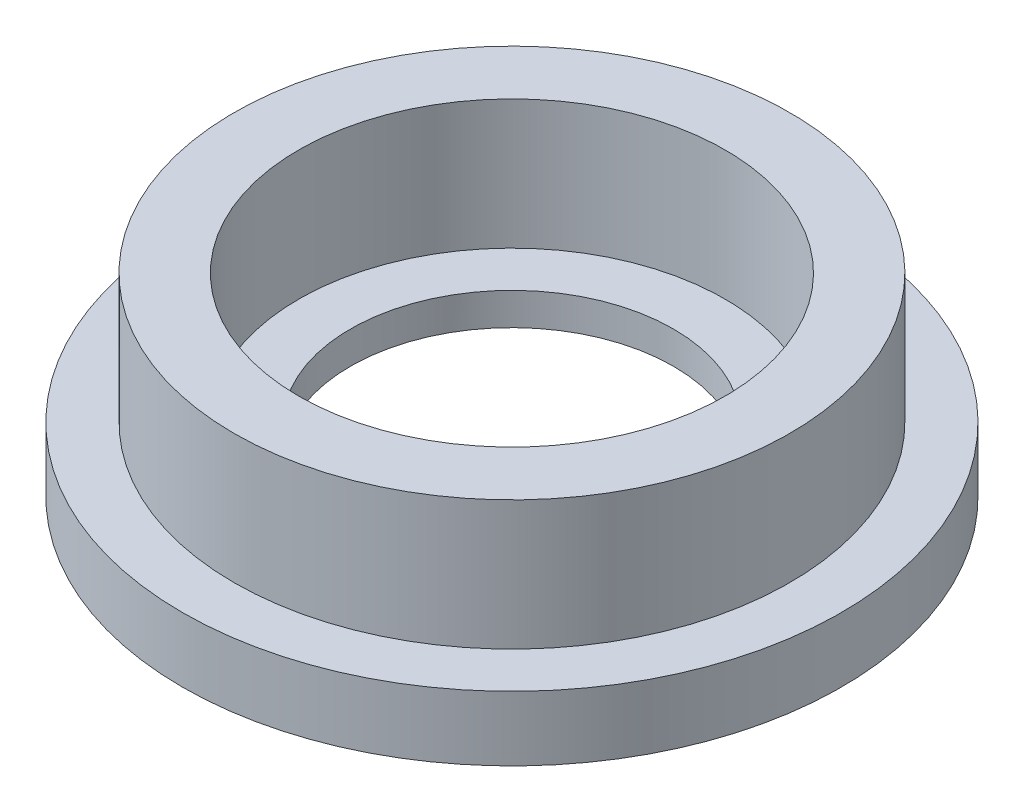
ISO-10303-21;
HEADER;
FILE_DESCRIPTION(('STEP AP214'),'2;1');
FILE_NAME('part.step','',(''),(''),'','','');
FILE_SCHEMA(('AUTOMOTIVE_DESIGN { 1 0 10303 214 1 1 1 1 }'));
ENDSEC;
DATA;
#1=APPLICATION_CONTEXT('core data for automotive mechanical design processes');
#2=APPLICATION_PROTOCOL_DEFINITION('international standard','automotive_design',2000,#1);
#3=PRODUCT_CONTEXT('',#1,'mechanical');
#4=PRODUCT('Part','Part','',(#3));
#5=PRODUCT_RELATED_PRODUCT_CATEGORY('part','',(#4));
#6=PRODUCT_DEFINITION_FORMATION('','',#4);
#7=PRODUCT_DEFINITION_CONTEXT('part definition',#1,'design');
#8=PRODUCT_DEFINITION('design','',#6,#7);
#9=PRODUCT_DEFINITION_SHAPE('','',#8);
#10=(LENGTH_UNIT() NAMED_UNIT(*) SI_UNIT(.MILLI.,.METRE.));
#11=(NAMED_UNIT(*) PLANE_ANGLE_UNIT() SI_UNIT($,.RADIAN.));
#12=(NAMED_UNIT(*) SI_UNIT($,.STERADIAN.) SOLID_ANGLE_UNIT());
#13=UNCERTAINTY_MEASURE_WITH_UNIT(LENGTH_MEASURE(1.E-05),#10,'distance_accuracy_value','');
#14=(GEOMETRIC_REPRESENTATION_CONTEXT(3) GLOBAL_UNCERTAINTY_ASSIGNED_CONTEXT((#13)) GLOBAL_UNIT_ASSIGNED_CONTEXT((#10,
#11,#12)) REPRESENTATION_CONTEXT('',''));
#15=CARTESIAN_POINT('',(0.,0.,0.));
#16=DIRECTION('',(0.,0.,1.));
#17=DIRECTION('',(1.,0.,0.));
#18=AXIS2_PLACEMENT_3D('',#15,#16,#17);
#19=CARTESIAN_POINT('',(0.,2.,0.));
#20=DIRECTION('',(0.,-1.,0.));
#21=DIRECTION('',(0.,0.,-1.));
#22=AXIS2_PLACEMENT_3D('',#19,#20,#21);
#23=CYLINDRICAL_SURFACE('',#22,2.5);
#24=CARTESIAN_POINT('',(0.,1.,0.));
#25=DIRECTION('',(0.,1.,0.));
#26=DIRECTION('',(0.,0.,1.));
#27=AXIS2_PLACEMENT_3D('',#24,#25,#26);
#28=CIRCLE('',#27,2.5);
#29=CARTESIAN_POINT('',(0.,1.,2.5));
#30=VERTEX_POINT('',#29);
#31=EDGE_CURVE('E59',#30,#30,#28,.T.);
#32=ORIENTED_EDGE('',*,*,#31,.T.);
#33=EDGE_LOOP('',(#32));
#34=FACE_BOUND('',#33,.T.);
#35=CARTESIAN_POINT('',(0.,0.5,0.));
#36=DIRECTION('',(0.,-1.,0.));
#37=DIRECTION('',(0.,0.,-1.));
#38=AXIS2_PLACEMENT_3D('',#35,#36,#37);
#39=CIRCLE('',#38,2.5);
#40=CARTESIAN_POINT('',(0.,0.5,-2.5));
#41=VERTEX_POINT('',#40);
#42=EDGE_CURVE('E45',#41,#41,#39,.F.);
#43=ORIENTED_EDGE('',*,*,#42,.F.);
#44=EDGE_LOOP('',(#43));
#45=FACE_BOUND('',#44,.T.);
#46=ADVANCED_FACE('F41',(#34,#45),#23,.F.);
#47=CARTESIAN_POINT('',(0.,1.,0.));
#48=DIRECTION('',(0.,-1.,0.));
#49=DIRECTION('',(0.,0.,-1.));
#50=AXIS2_PLACEMENT_3D('',#47,#48,#49);
#51=CYLINDRICAL_SURFACE('',#50,5.1);
#52=CARTESIAN_POINT('',(0.,1.,0.));
#53=DIRECTION('',(0.,1.,0.));
#54=DIRECTION('',(0.,0.,1.));
#55=AXIS2_PLACEMENT_3D('',#52,#53,#54);
#56=CIRCLE('',#55,5.1);
#57=CARTESIAN_POINT('',(0.,1.,5.1));
#58=VERTEX_POINT('',#57);
#59=EDGE_CURVE('E50',#58,#58,#56,.T.);
#60=ORIENTED_EDGE('',*,*,#59,.F.);
#61=EDGE_LOOP('',(#60));
#62=FACE_BOUND('',#61,.T.);
#63=CARTESIAN_POINT('',(0.,0.,0.));
#64=DIRECTION('',(0.,1.,0.));
#65=DIRECTION('',(0.,0.,1.));
#66=AXIS2_PLACEMENT_3D('',#63,#64,#65);
#67=CIRCLE('',#66,5.1);
#68=CARTESIAN_POINT('',(0.,0.,5.1));
#69=VERTEX_POINT('',#68);
#70=EDGE_CURVE('E56',#69,#69,#67,.T.);
#71=ORIENTED_EDGE('',*,*,#70,.T.);
#72=EDGE_LOOP('',(#71));
#73=FACE_BOUND('',#72,.T.);
#74=ADVANCED_FACE('F43',(#62,#73),#51,.T.);
#75=CARTESIAN_POINT('',(0.,1.,0.));
#76=DIRECTION('',(0.,1.,0.));
#77=DIRECTION('',(0.,0.,1.));
#78=AXIS2_PLACEMENT_3D('',#75,#76,#77);
#79=PLANE('',#78);
#80=CARTESIAN_POINT('',(0.,1.,0.));
#81=DIRECTION('',(0.,1.,0.));
#82=DIRECTION('',(0.,0.,1.));
#83=AXIS2_PLACEMENT_3D('',#80,#81,#82);
#84=CIRCLE('',#83,4.3);
#85=CARTESIAN_POINT('',(0.,1.,4.3));
#86=VERTEX_POINT('',#85);
#87=EDGE_CURVE('E68',#86,#86,#84,.T.);
#88=ORIENTED_EDGE('',*,*,#87,.F.);
#89=EDGE_LOOP('',(#88));
#90=FACE_BOUND('',#89,.T.);
#91=ORIENTED_EDGE('',*,*,#59,.T.);
#92=EDGE_LOOP('',(#91));
#93=FACE_BOUND('',#92,.T.);
#94=ADVANCED_FACE('F94',(#90,#93),#79,.T.);
#95=CARTESIAN_POINT('',(0.,0.,0.));
#96=DIRECTION('',(0.,1.,0.));
#97=DIRECTION('',(0.,0.,1.));
#98=AXIS2_PLACEMENT_3D('',#95,#96,#97);
#99=PLANE('',#98);
#100=CARTESIAN_POINT('',(0.,0.,0.));
#101=DIRECTION('',(0.,-1.,0.));
#102=DIRECTION('',(0.,0.,-1.));
#103=AXIS2_PLACEMENT_3D('',#100,#101,#102);
#104=CIRCLE('',#103,3.3);
#105=CARTESIAN_POINT('',(0.,0.,-3.3));
#106=VERTEX_POINT('',#105);
#107=EDGE_CURVE('E76',#106,#106,#104,.T.);
#108=ORIENTED_EDGE('',*,*,#107,.F.);
#109=EDGE_LOOP('',(#108));
#110=FACE_BOUND('',#109,.T.);
#111=ORIENTED_EDGE('',*,*,#70,.F.);
#112=EDGE_LOOP('',(#111));
#113=FACE_BOUND('',#112,.T.);
#114=ADVANCED_FACE('F97',(#110,#113),#99,.F.);
#115=CARTESIAN_POINT('',(0.,3.,0.));
#116=DIRECTION('',(0.,1.,0.));
#117=DIRECTION('',(0.,0.,1.));
#118=AXIS2_PLACEMENT_3D('',#115,#116,#117);
#119=PLANE('',#118);
#120=CARTESIAN_POINT('',(0.,3.,0.));
#121=DIRECTION('',(0.,1.,0.));
#122=DIRECTION('',(0.,0.,1.));
#123=AXIS2_PLACEMENT_3D('',#120,#121,#122);
#124=CIRCLE('',#123,4.3);
#125=CARTESIAN_POINT('',(0.,3.,4.3));
#126=VERTEX_POINT('',#125);
#127=EDGE_CURVE('E84',#126,#126,#124,.T.);
#128=ORIENTED_EDGE('',*,*,#127,.T.);
#129=EDGE_LOOP('',(#128));
#130=FACE_BOUND('',#129,.T.);
#131=CARTESIAN_POINT('',(0.,3.,0.));
#132=DIRECTION('',(0.,1.,0.));
#133=DIRECTION('',(0.,0.,1.));
#134=AXIS2_PLACEMENT_3D('',#131,#132,#133);
#135=CIRCLE('',#134,3.3);
#136=CARTESIAN_POINT('',(0.,3.,3.3));
#137=VERTEX_POINT('',#136);
#138=EDGE_CURVE('E62',#137,#137,#135,.T.);
#139=ORIENTED_EDGE('',*,*,#138,.F.);
#140=EDGE_LOOP('',(#139));
#141=FACE_BOUND('',#140,.T.);
#142=ADVANCED_FACE('F109',(#130,#141),#119,.T.);
#143=CARTESIAN_POINT('',(0.,3.,0.));
#144=DIRECTION('',(0.,-1.,0.));
#145=DIRECTION('',(0.,0.,-1.));
#146=AXIS2_PLACEMENT_3D('',#143,#144,#145);
#147=CYLINDRICAL_SURFACE('',#146,4.3);
#148=ORIENTED_EDGE('',*,*,#127,.F.);
#149=EDGE_LOOP('',(#148));
#150=FACE_BOUND('',#149,.T.);
#151=ORIENTED_EDGE('',*,*,#87,.T.);
#152=EDGE_LOOP('',(#151));
#153=FACE_BOUND('',#152,.T.);
#154=ADVANCED_FACE('F92',(#150,#153),#147,.T.);
#155=CARTESIAN_POINT('',(0.,3.,0.));
#156=DIRECTION('',(0.,-1.,0.));
#157=DIRECTION('',(0.,0.,-1.));
#158=AXIS2_PLACEMENT_3D('',#155,#156,#157);
#159=CYLINDRICAL_SURFACE('',#158,3.3);
#160=ORIENTED_EDGE('',*,*,#138,.T.);
#161=EDGE_LOOP('',(#160));
#162=FACE_BOUND('',#161,.T.);
#163=CARTESIAN_POINT('',(0.,1.,0.));
#164=DIRECTION('',(0.,1.,0.));
#165=DIRECTION('',(0.,0.,1.));
#166=AXIS2_PLACEMENT_3D('',#163,#164,#165);
#167=CIRCLE('',#166,3.3);
#168=CARTESIAN_POINT('',(0.,1.,3.3));
#169=VERTEX_POINT('',#168);
#170=EDGE_CURVE('E10',#169,#169,#167,.F.);
#171=ORIENTED_EDGE('',*,*,#170,.T.);
#172=EDGE_LOOP('',(#171));
#173=FACE_BOUND('',#172,.T.);
#174=ADVANCED_FACE('F128',(#162,#173),#159,.F.);
#175=ORIENTED_EDGE('',*,*,#31,.F.);
#176=EDGE_LOOP('',(#175));
#177=FACE_BOUND('',#176,.T.);
#178=ORIENTED_EDGE('',*,*,#170,.F.);
#179=EDGE_LOOP('',(#178));
#180=FACE_BOUND('',#179,.T.);
#181=ADVANCED_FACE('F99',(#177,#180),#79,.T.);
#182=CARTESIAN_POINT('',(0.,0.5,0.));
#183=DIRECTION('',(0.,-1.,0.));
#184=DIRECTION('',(0.,0.,-1.));
#185=AXIS2_PLACEMENT_3D('',#182,#183,#184);
#186=PLANE('',#185);
#187=CARTESIAN_POINT('',(0.,0.5,0.));
#188=DIRECTION('',(0.,-1.,0.));
#189=DIRECTION('',(0.,0.,-1.));
#190=AXIS2_PLACEMENT_3D('',#187,#188,#189);
#191=CIRCLE('',#190,3.3);
#192=CARTESIAN_POINT('',(0.,0.5,-3.3));
#193=VERTEX_POINT('',#192);
#194=EDGE_CURVE('E71',#193,#193,#191,.T.);
#195=ORIENTED_EDGE('',*,*,#194,.T.);
#196=EDGE_LOOP('',(#195));
#197=FACE_BOUND('',#196,.T.);
#198=ORIENTED_EDGE('',*,*,#42,.T.);
#199=EDGE_LOOP('',(#198));
#200=FACE_BOUND('',#199,.T.);
#201=ADVANCED_FACE('F152',(#197,#200),#186,.T.);
#202=CARTESIAN_POINT('',(0.,0.5,0.));
#203=DIRECTION('',(0.,-1.,0.));
#204=DIRECTION('',(0.,0.,-1.));
#205=AXIS2_PLACEMENT_3D('',#202,#203,#204);
#206=CYLINDRICAL_SURFACE('',#205,3.3);
#207=ORIENTED_EDGE('',*,*,#194,.F.);
#208=EDGE_LOOP('',(#207));
#209=FACE_BOUND('',#208,.T.);
#210=ORIENTED_EDGE('',*,*,#107,.T.);
#211=EDGE_LOOP('',(#210));
#212=FACE_BOUND('',#211,.T.);
#213=ADVANCED_FACE('F126',(#209,#212),#206,.F.);
#214=CLOSED_SHELL('',(#46,#74,#94,#114,#142,#154,#174,#181,#201,#213));
#215=MANIFOLD_SOLID_BREP('B2',#214);
#216=ADVANCED_BREP_SHAPE_REPRESENTATION('',(#18,#215),#14);
#217=SHAPE_DEFINITION_REPRESENTATION(#9,#216);
ENDSEC;
END-ISO-10303-21;
